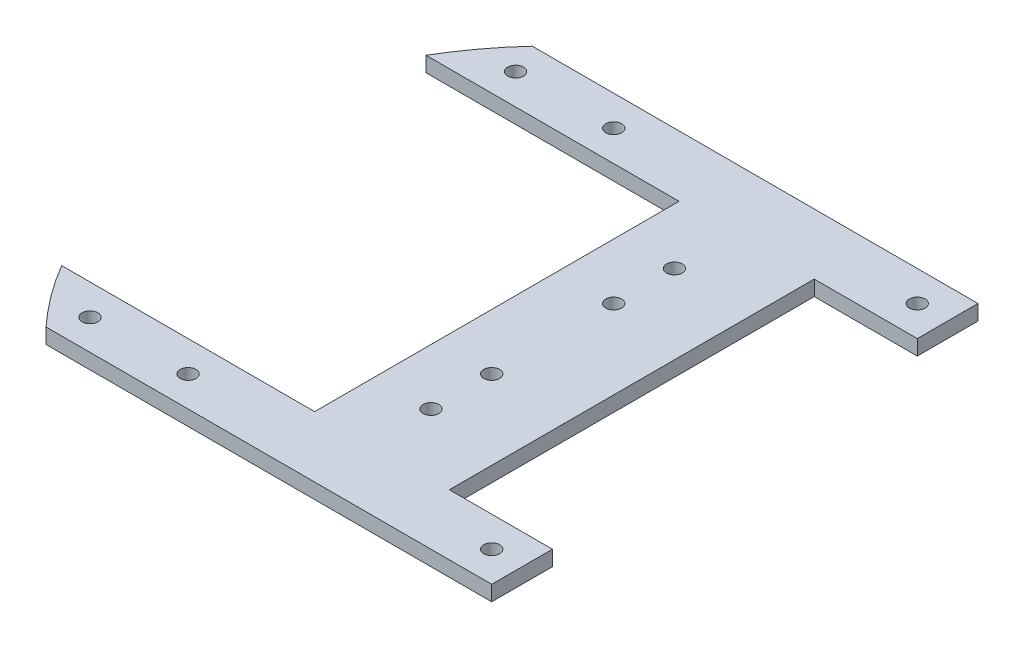
ISO-10303-21;
HEADER;
FILE_DESCRIPTION(('STEP AP214'),'2;1');
FILE_NAME('part.step','',(''),(''),'','','');
FILE_SCHEMA(('AUTOMOTIVE_DESIGN { 1 0 10303 214 1 1 1 1 }'));
ENDSEC;
DATA;
#1=APPLICATION_CONTEXT('core data for automotive mechanical design processes');
#2=APPLICATION_PROTOCOL_DEFINITION('international standard','automotive_design',2000,#1);
#3=PRODUCT_CONTEXT('',#1,'mechanical');
#4=PRODUCT('Part','Part','',(#3));
#5=PRODUCT_RELATED_PRODUCT_CATEGORY('part','',(#4));
#6=PRODUCT_DEFINITION_FORMATION('','',#4);
#7=PRODUCT_DEFINITION_CONTEXT('part definition',#1,'design');
#8=PRODUCT_DEFINITION('design','',#6,#7);
#9=PRODUCT_DEFINITION_SHAPE('','',#8);
#10=(LENGTH_UNIT() NAMED_UNIT(*) SI_UNIT(.MILLI.,.METRE.));
#11=(NAMED_UNIT(*) PLANE_ANGLE_UNIT() SI_UNIT($,.RADIAN.));
#12=(NAMED_UNIT(*) SI_UNIT($,.STERADIAN.) SOLID_ANGLE_UNIT());
#13=UNCERTAINTY_MEASURE_WITH_UNIT(LENGTH_MEASURE(1.E-05),#10,'distance_accuracy_value','');
#14=(GEOMETRIC_REPRESENTATION_CONTEXT(3) GLOBAL_UNCERTAINTY_ASSIGNED_CONTEXT((#13)) GLOBAL_UNIT_ASSIGNED_CONTEXT((#10,
#11,#12)) REPRESENTATION_CONTEXT('',''));
#15=CARTESIAN_POINT('',(0.,0.,0.));
#16=DIRECTION('',(0.,0.,1.));
#17=DIRECTION('',(1.,0.,0.));
#18=AXIS2_PLACEMENT_3D('',#15,#16,#17);
#19=CARTESIAN_POINT('',(0.,3.175,0.));
#20=DIRECTION('',(0.,1.,0.));
#21=DIRECTION('',(0.,0.,1.));
#22=AXIS2_PLACEMENT_3D('',#19,#20,#21);
#23=PLANE('',#22);
#24=DIRECTION('',(-1.,0.,0.));
#25=VECTOR('',#24,1.);
#26=CARTESIAN_POINT('',(-64.6017801612308,3.175,-38.1));
#27=LINE('',#26,#25);
#28=CARTESIAN_POINT('',(-11.6869128143214,3.175,-38.1));
#29=VERTEX_POINT('',#28);
#30=CARTESIAN_POINT('',(-64.6017801612308,3.175,-38.1));
#31=VERTEX_POINT('',#30);
#32=EDGE_CURVE('E130',#29,#31,#27,.T.);
#33=ORIENTED_EDGE('',*,*,#32,.F.);
#34=DIRECTION('',(0.,0.,-1.));
#35=VECTOR('',#34,1.);
#36=CARTESIAN_POINT('',(-11.6869128143214,3.175,-38.1));
#37=LINE('',#36,#35);
#38=CARTESIAN_POINT('',(-11.6869128143214,3.175,38.1));
#39=VERTEX_POINT('',#38);
#40=EDGE_CURVE('E139',#39,#29,#37,.T.);
#41=ORIENTED_EDGE('',*,*,#40,.F.);
#42=DIRECTION('',(1.,0.,0.));
#43=VECTOR('',#42,1.);
#44=CARTESIAN_POINT('',(-11.6869128143214,3.175,38.1));
#45=LINE('',#44,#43);
#46=CARTESIAN_POINT('',(-64.6017801612308,3.175,38.1));
#47=VERTEX_POINT('',#46);
#48=EDGE_CURVE('E124',#47,#39,#45,.T.);
#49=ORIENTED_EDGE('',*,*,#48,.F.);
#50=CARTESIAN_POINT('',(0.,3.175,0.));
#51=DIRECTION('',(0.,1.,0.));
#52=DIRECTION('',(0.,0.,1.));
#53=AXIS2_PLACEMENT_3D('',#50,#51,#52);
#54=CIRCLE('',#53,75.);
#55=CARTESIAN_POINT('',(-55.1227591712517,3.175,50.8574618059944));
#56=VERTEX_POINT('',#55);
#57=EDGE_CURVE('E136',#47,#56,#54,.T.);
#58=ORIENTED_EDGE('',*,*,#57,.T.);
#59=DIRECTION('',(1.,0.,0.));
#60=VECTOR('',#59,1.);
#61=CARTESIAN_POINT('',(55.1227591712517,3.175,50.8574618059944));
#62=LINE('',#61,#60);
#63=CARTESIAN_POINT('',(38.1,3.175,50.8574618059944));
#64=VERTEX_POINT('',#63);
#65=EDGE_CURVE('E144',#56,#64,#62,.T.);
#66=ORIENTED_EDGE('',*,*,#65,.T.);
#67=DIRECTION('',(0.,0.,1.));
#68=VECTOR('',#67,1.);
#69=CARTESIAN_POINT('',(38.1,3.175,50.8574618059944));
#70=LINE('',#69,#68);
#71=CARTESIAN_POINT('',(38.1,3.175,38.1574618059944));
#72=VERTEX_POINT('',#71);
#73=EDGE_CURVE('E56',#72,#64,#70,.T.);
#74=ORIENTED_EDGE('',*,*,#73,.F.);
#75=DIRECTION('',(1.,0.,0.));
#76=VECTOR('',#75,1.);
#77=CARTESIAN_POINT('',(38.1,3.175,38.1574618059944));
#78=LINE('',#77,#76);
#79=CARTESIAN_POINT('',(16.55045545372,3.175,38.1574618059944));
#80=VERTEX_POINT('',#79);
#81=EDGE_CURVE('E195',#80,#72,#78,.T.);
#82=ORIENTED_EDGE('',*,*,#81,.F.);
#83=DIRECTION('',(0.,0.,1.));
#84=VECTOR('',#83,1.);
#85=CARTESIAN_POINT('',(16.55045545372,3.175,38.1574618059944));
#86=LINE('',#85,#84);
#87=CARTESIAN_POINT('',(16.55045545372,3.175,-38.1574618059944));
#88=VERTEX_POINT('',#87);
#89=EDGE_CURVE('E192',#88,#80,#86,.T.);
#90=ORIENTED_EDGE('',*,*,#89,.F.);
#91=DIRECTION('',(-1.,0.,0.));
#92=VECTOR('',#91,1.);
#93=CARTESIAN_POINT('',(16.55045545372,3.175,-38.1574618059944));
#94=LINE('',#93,#92);
#95=CARTESIAN_POINT('',(38.1,3.175,-38.1574618059944));
#96=VERTEX_POINT('',#95);
#97=EDGE_CURVE('E188',#96,#88,#94,.T.);
#98=ORIENTED_EDGE('',*,*,#97,.F.);
#99=DIRECTION('',(0.,0.,1.));
#100=VECTOR('',#99,1.);
#101=CARTESIAN_POINT('',(38.1,3.175,-38.1574618059944));
#102=LINE('',#101,#100);
#103=CARTESIAN_POINT('',(38.1,3.175,-50.8574618059944));
#104=VERTEX_POINT('',#103);
#105=EDGE_CURVE('E185',#104,#96,#102,.T.);
#106=ORIENTED_EDGE('',*,*,#105,.F.);
#107=DIRECTION('',(-1.,0.,0.));
#108=VECTOR('',#107,1.);
#109=CARTESIAN_POINT('',(-55.1227591712517,3.175,-50.8574618059944));
#110=LINE('',#109,#108);
#111=CARTESIAN_POINT('',(-55.1227591712517,3.175,-50.8574618059945));
#112=VERTEX_POINT('',#111);
#113=EDGE_CURVE('E149',#104,#112,#110,.T.);
#114=ORIENTED_EDGE('',*,*,#113,.T.);
#115=CARTESIAN_POINT('',(0.,3.175,0.));
#116=DIRECTION('',(0.,1.,0.));
#117=DIRECTION('',(0.,0.,1.));
#118=AXIS2_PLACEMENT_3D('',#115,#116,#117);
#119=CIRCLE('',#118,75.);
#120=EDGE_CURVE('E145',#112,#31,#119,.T.);
#121=ORIENTED_EDGE('',*,*,#120,.T.);
#122=EDGE_LOOP('',(#33,#41,#49,#58,#66,#74,#82,#90,#98,#106,#114,#121));
#123=FACE_BOUND('',#122,.T.);
#124=CARTESIAN_POINT('',(0.,3.175,-25.4574618059944));
#125=DIRECTION('',(0.,1.,0.));
#126=DIRECTION('',(0.,0.,-1.));
#127=AXIS2_PLACEMENT_3D('',#124,#125,#126);
#128=CIRCLE('',#127,1.65099999999997);
#129=CARTESIAN_POINT('',(0.,3.175,-27.1084618059944));
#130=VERTEX_POINT('',#129);
#131=EDGE_CURVE('E215',#130,#130,#128,.T.);
#132=ORIENTED_EDGE('',*,*,#131,.F.);
#133=EDGE_LOOP('',(#132));
#134=FACE_BOUND('',#133,.T.);
#135=CARTESIAN_POINT('',(-31.75,3.175,-44.5074618059944));
#136=DIRECTION('',(0.,1.,0.));
#137=DIRECTION('',(0.,0.,1.));
#138=AXIS2_PLACEMENT_3D('',#135,#136,#137);
#139=CIRCLE('',#138,1.65099999999997);
#140=CARTESIAN_POINT('',(-31.75,3.175,-42.8564618059944));
#141=VERTEX_POINT('',#140);
#142=EDGE_CURVE('E227',#141,#141,#139,.T.);
#143=ORIENTED_EDGE('',*,*,#142,.F.);
#144=EDGE_LOOP('',(#143));
#145=FACE_BOUND('',#144,.T.);
#146=CARTESIAN_POINT('',(-52.2676605903492,3.175,-44.5074618059944));
#147=DIRECTION('',(0.,1.,0.));
#148=DIRECTION('',(0.,0.,1.));
#149=AXIS2_PLACEMENT_3D('',#146,#147,#148);
#150=CIRCLE('',#149,1.65099999999997);
#151=CARTESIAN_POINT('',(-52.2676605903492,3.175,-42.8564618059944));
#152=VERTEX_POINT('',#151);
#153=EDGE_CURVE('E239',#152,#152,#150,.T.);
#154=ORIENTED_EDGE('',*,*,#153,.F.);
#155=EDGE_LOOP('',(#154));
#156=FACE_BOUND('',#155,.T.);
#157=CARTESIAN_POINT('',(31.75,3.175,44.5074618059944));
#158=DIRECTION('',(0.,1.,0.));
#159=DIRECTION('',(0.,0.,1.));
#160=AXIS2_PLACEMENT_3D('',#157,#158,#159);
#161=CIRCLE('',#160,1.65099999999998);
#162=CARTESIAN_POINT('',(31.75,3.175,46.1584618059944));
#163=VERTEX_POINT('',#162);
#164=EDGE_CURVE('E251',#163,#163,#161,.T.);
#165=ORIENTED_EDGE('',*,*,#164,.F.);
#166=EDGE_LOOP('',(#165));
#167=FACE_BOUND('',#166,.T.);
#168=CARTESIAN_POINT('',(0.,3.175,12.7574618059944));
#169=DIRECTION('',(0.,1.,0.));
#170=DIRECTION('',(0.,0.,1.));
#171=AXIS2_PLACEMENT_3D('',#168,#169,#170);
#172=CIRCLE('',#171,1.65099999999997);
#173=CARTESIAN_POINT('',(0.,3.175,14.4084618059944));
#174=VERTEX_POINT('',#173);
#175=EDGE_CURVE('E156',#174,#174,#172,.T.);
#176=ORIENTED_EDGE('',*,*,#175,.F.);
#177=EDGE_LOOP('',(#176));
#178=FACE_BOUND('',#177,.T.);
#179=CARTESIAN_POINT('',(0.,3.175,25.4574618059944));
#180=DIRECTION('',(0.,1.,0.));
#181=DIRECTION('',(0.,0.,1.));
#182=AXIS2_PLACEMENT_3D('',#179,#180,#181);
#183=CIRCLE('',#182,1.65099999999997);
#184=CARTESIAN_POINT('',(0.,3.175,27.1084618059944));
#185=VERTEX_POINT('',#184);
#186=EDGE_CURVE('E257',#185,#185,#183,.T.);
#187=ORIENTED_EDGE('',*,*,#186,.F.);
#188=EDGE_LOOP('',(#187));
#189=FACE_BOUND('',#188,.T.);
#190=CARTESIAN_POINT('',(-31.75,3.175,44.5074618059944));
#191=DIRECTION('',(0.,1.,0.));
#192=DIRECTION('',(0.,0.,1.));
#193=AXIS2_PLACEMENT_3D('',#190,#191,#192);
#194=CIRCLE('',#193,1.65099999999997);
#195=CARTESIAN_POINT('',(-31.75,3.175,46.1584618059944));
#196=VERTEX_POINT('',#195);
#197=EDGE_CURVE('E245',#196,#196,#194,.T.);
#198=ORIENTED_EDGE('',*,*,#197,.F.);
#199=EDGE_LOOP('',(#198));
#200=FACE_BOUND('',#199,.T.);
#201=CARTESIAN_POINT('',(-52.2676605903492,3.175,44.5074618059944));
#202=DIRECTION('',(0.,1.,0.));
#203=DIRECTION('',(0.,0.,1.));
#204=AXIS2_PLACEMENT_3D('',#201,#202,#203);
#205=CIRCLE('',#204,1.65099999999997);
#206=CARTESIAN_POINT('',(-52.2676605903492,3.175,46.1584618059944));
#207=VERTEX_POINT('',#206);
#208=EDGE_CURVE('E233',#207,#207,#205,.T.);
#209=ORIENTED_EDGE('',*,*,#208,.F.);
#210=EDGE_LOOP('',(#209));
#211=FACE_BOUND('',#210,.T.);
#212=CARTESIAN_POINT('',(31.75,3.175,-44.5074618059944));
#213=DIRECTION('',(0.,1.,0.));
#214=DIRECTION('',(0.,0.,1.));
#215=AXIS2_PLACEMENT_3D('',#212,#213,#214);
#216=CIRCLE('',#215,1.65099999999997);
#217=CARTESIAN_POINT('',(31.75,3.175,-42.8564618059944));
#218=VERTEX_POINT('',#217);
#219=EDGE_CURVE('E221',#218,#218,#216,.T.);
#220=ORIENTED_EDGE('',*,*,#219,.F.);
#221=EDGE_LOOP('',(#220));
#222=FACE_BOUND('',#221,.T.);
#223=CARTESIAN_POINT('',(0.,3.175,-12.7574618059944));
#224=DIRECTION('',(0.,1.,0.));
#225=DIRECTION('',(0.,0.,-1.));
#226=AXIS2_PLACEMENT_3D('',#223,#224,#225);
#227=CIRCLE('',#226,1.65099999999997);
#228=CARTESIAN_POINT('',(0.,3.175,-14.4084618059944));
#229=VERTEX_POINT('',#228);
#230=EDGE_CURVE('E179',#229,#229,#227,.T.);
#231=ORIENTED_EDGE('',*,*,#230,.F.);
#232=EDGE_LOOP('',(#231));
#233=FACE_BOUND('',#232,.T.);
#234=ADVANCED_FACE('F33',(#123,#134,#145,#156,#167,#178,#189,#200,#211,#222,#233),#23,.T.);
#235=CARTESIAN_POINT('',(0.,0.,0.));
#236=DIRECTION('',(0.,1.,0.));
#237=DIRECTION('',(0.,0.,1.));
#238=AXIS2_PLACEMENT_3D('',#235,#236,#237);
#239=PLANE('',#238);
#240=CARTESIAN_POINT('',(0.,0.,-25.4574618059944));
#241=DIRECTION('',(0.,1.,0.));
#242=DIRECTION('',(0.,0.,-1.));
#243=AXIS2_PLACEMENT_3D('',#240,#241,#242);
#244=CIRCLE('',#243,1.65099999999997);
#245=CARTESIAN_POINT('',(0.,0.,-27.1084618059944));
#246=VERTEX_POINT('',#245);
#247=EDGE_CURVE('E213',#246,#246,#244,.T.);
#248=ORIENTED_EDGE('',*,*,#247,.T.);
#249=EDGE_LOOP('',(#248));
#250=FACE_BOUND('',#249,.T.);
#251=CARTESIAN_POINT('',(-31.75,0.,-44.5074618059944));
#252=DIRECTION('',(0.,1.,0.));
#253=DIRECTION('',(0.,0.,1.));
#254=AXIS2_PLACEMENT_3D('',#251,#252,#253);
#255=CIRCLE('',#254,1.65099999999997);
#256=CARTESIAN_POINT('',(-31.75,0.,-42.8564618059944));
#257=VERTEX_POINT('',#256);
#258=EDGE_CURVE('E224',#257,#257,#255,.T.);
#259=ORIENTED_EDGE('',*,*,#258,.T.);
#260=EDGE_LOOP('',(#259));
#261=FACE_BOUND('',#260,.T.);
#262=CARTESIAN_POINT('',(-52.2676605903492,0.,-44.5074618059944));
#263=DIRECTION('',(0.,1.,0.));
#264=DIRECTION('',(0.,0.,1.));
#265=AXIS2_PLACEMENT_3D('',#262,#263,#264);
#266=CIRCLE('',#265,1.65099999999997);
#267=CARTESIAN_POINT('',(-52.2676605903492,0.,-42.8564618059944));
#268=VERTEX_POINT('',#267);
#269=EDGE_CURVE('E236',#268,#268,#266,.T.);
#270=ORIENTED_EDGE('',*,*,#269,.T.);
#271=EDGE_LOOP('',(#270));
#272=FACE_BOUND('',#271,.T.);
#273=CARTESIAN_POINT('',(31.75,0.,44.5074618059944));
#274=DIRECTION('',(0.,1.,0.));
#275=DIRECTION('',(0.,0.,1.));
#276=AXIS2_PLACEMENT_3D('',#273,#274,#275);
#277=CIRCLE('',#276,1.65099999999998);
#278=CARTESIAN_POINT('',(31.75,0.,46.1584618059944));
#279=VERTEX_POINT('',#278);
#280=EDGE_CURVE('E248',#279,#279,#277,.T.);
#281=ORIENTED_EDGE('',*,*,#280,.T.);
#282=EDGE_LOOP('',(#281));
#283=FACE_BOUND('',#282,.T.);
#284=CARTESIAN_POINT('',(0.,0.,12.7574618059944));
#285=DIRECTION('',(0.,1.,0.));
#286=DIRECTION('',(0.,0.,1.));
#287=AXIS2_PLACEMENT_3D('',#284,#285,#286);
#288=CIRCLE('',#287,1.65099999999997);
#289=CARTESIAN_POINT('',(0.,0.,14.4084618059944));
#290=VERTEX_POINT('',#289);
#291=EDGE_CURVE('E260',#290,#290,#288,.T.);
#292=ORIENTED_EDGE('',*,*,#291,.T.);
#293=EDGE_LOOP('',(#292));
#294=FACE_BOUND('',#293,.T.);
#295=DIRECTION('',(0.,0.,1.));
#296=VECTOR('',#295,1.);
#297=CARTESIAN_POINT('',(-11.6869128143214,0.,-38.1));
#298=LINE('',#297,#296);
#299=CARTESIAN_POINT('',(-11.6869128143214,0.,-38.1));
#300=VERTEX_POINT('',#299);
#301=CARTESIAN_POINT('',(-11.6869128143214,0.,38.1));
#302=VERTEX_POINT('',#301);
#303=EDGE_CURVE('E283',#300,#302,#298,.T.);
#304=ORIENTED_EDGE('',*,*,#303,.F.);
#305=DIRECTION('',(1.,0.,0.));
#306=VECTOR('',#305,1.);
#307=CARTESIAN_POINT('',(-64.6017801612308,0.,-38.1));
#308=LINE('',#307,#306);
#309=CARTESIAN_POINT('',(-64.6017801612308,0.,-38.1));
#310=VERTEX_POINT('',#309);
#311=EDGE_CURVE('E189',#310,#300,#308,.T.);
#312=ORIENTED_EDGE('',*,*,#311,.F.);
#313=CARTESIAN_POINT('',(0.,0.,0.));
#314=DIRECTION('',(0.,1.,0.));
#315=DIRECTION('',(0.,0.,1.));
#316=AXIS2_PLACEMENT_3D('',#313,#314,#315);
#317=CIRCLE('',#316,75.);
#318=CARTESIAN_POINT('',(-55.1227591712517,0.,-50.8574618059945));
#319=VERTEX_POINT('',#318);
#320=EDGE_CURVE('E155',#319,#310,#317,.T.);
#321=ORIENTED_EDGE('',*,*,#320,.F.);
#322=DIRECTION('',(-1.,0.,0.));
#323=VECTOR('',#322,1.);
#324=CARTESIAN_POINT('',(-55.1227591712517,0.,-50.8574618059944));
#325=LINE('',#324,#323);
#326=CARTESIAN_POINT('',(38.1,0.,-50.8574618059944));
#327=VERTEX_POINT('',#326);
#328=EDGE_CURVE('E153',#327,#319,#325,.T.);
#329=ORIENTED_EDGE('',*,*,#328,.F.);
#330=DIRECTION('',(0.,0.,-1.));
#331=VECTOR('',#330,1.);
#332=CARTESIAN_POINT('',(38.1,0.,-38.1574618059944));
#333=LINE('',#332,#331);
#334=CARTESIAN_POINT('',(38.1,0.,-38.1574618059944));
#335=VERTEX_POINT('',#334);
#336=EDGE_CURVE('E202',#335,#327,#333,.T.);
#337=ORIENTED_EDGE('',*,*,#336,.F.);
#338=DIRECTION('',(1.,0.,0.));
#339=VECTOR('',#338,1.);
#340=CARTESIAN_POINT('',(16.55045545372,0.,-38.1574618059944));
#341=LINE('',#340,#339);
#342=CARTESIAN_POINT('',(16.55045545372,0.,-38.1574618059944));
#343=VERTEX_POINT('',#342);
#344=EDGE_CURVE('E291',#343,#335,#341,.T.);
#345=ORIENTED_EDGE('',*,*,#344,.F.);
#346=DIRECTION('',(0.,0.,-1.));
#347=VECTOR('',#346,1.);
#348=CARTESIAN_POINT('',(16.55045545372,0.,38.1574618059944));
#349=LINE('',#348,#347);
#350=CARTESIAN_POINT('',(16.55045545372,0.,38.1574618059944));
#351=VERTEX_POINT('',#350);
#352=EDGE_CURVE('E181',#351,#343,#349,.T.);
#353=ORIENTED_EDGE('',*,*,#352,.F.);
#354=DIRECTION('',(-1.,0.,0.));
#355=VECTOR('',#354,1.);
#356=CARTESIAN_POINT('',(38.1,0.,38.1574618059944));
#357=LINE('',#356,#355);
#358=CARTESIAN_POINT('',(38.1,0.,38.1574618059944));
#359=VERTEX_POINT('',#358);
#360=EDGE_CURVE('E174',#359,#351,#357,.T.);
#361=ORIENTED_EDGE('',*,*,#360,.F.);
#362=DIRECTION('',(0.,0.,-1.));
#363=VECTOR('',#362,1.);
#364=CARTESIAN_POINT('',(38.1,0.,50.8574618059944));
#365=LINE('',#364,#363);
#366=CARTESIAN_POINT('',(38.1,0.,50.8574618059944));
#367=VERTEX_POINT('',#366);
#368=EDGE_CURVE('E172',#367,#359,#365,.T.);
#369=ORIENTED_EDGE('',*,*,#368,.F.);
#370=DIRECTION('',(1.,0.,0.));
#371=VECTOR('',#370,1.);
#372=CARTESIAN_POINT('',(55.1227591712517,0.,50.8574618059944));
#373=LINE('',#372,#371);
#374=CARTESIAN_POINT('',(-55.1227591712517,0.,50.8574618059944));
#375=VERTEX_POINT('',#374);
#376=EDGE_CURVE('E161',#375,#367,#373,.T.);
#377=ORIENTED_EDGE('',*,*,#376,.F.);
#378=CARTESIAN_POINT('',(0.,0.,0.));
#379=DIRECTION('',(0.,1.,0.));
#380=DIRECTION('',(0.,0.,1.));
#381=AXIS2_PLACEMENT_3D('',#378,#379,#380);
#382=CIRCLE('',#381,75.);
#383=CARTESIAN_POINT('',(-64.6017801612308,0.,38.1));
#384=VERTEX_POINT('',#383);
#385=EDGE_CURVE('E159',#384,#375,#382,.T.);
#386=ORIENTED_EDGE('',*,*,#385,.F.);
#387=DIRECTION('',(-1.,0.,0.));
#388=VECTOR('',#387,1.);
#389=CARTESIAN_POINT('',(-11.6869128143214,0.,38.1));
#390=LINE('',#389,#388);
#391=EDGE_CURVE('E48',#302,#384,#390,.T.);
#392=ORIENTED_EDGE('',*,*,#391,.F.);
#393=EDGE_LOOP('',(#304,#312,#321,#329,#337,#345,#353,#361,#369,#377,#386,#392));
#394=FACE_BOUND('',#393,.T.);
#395=CARTESIAN_POINT('',(0.,0.,25.4574618059944));
#396=DIRECTION('',(0.,1.,0.));
#397=DIRECTION('',(0.,0.,1.));
#398=AXIS2_PLACEMENT_3D('',#395,#396,#397);
#399=CIRCLE('',#398,1.65099999999997);
#400=CARTESIAN_POINT('',(0.,0.,27.1084618059944));
#401=VERTEX_POINT('',#400);
#402=EDGE_CURVE('E254',#401,#401,#399,.T.);
#403=ORIENTED_EDGE('',*,*,#402,.T.);
#404=EDGE_LOOP('',(#403));
#405=FACE_BOUND('',#404,.T.);
#406=CARTESIAN_POINT('',(-31.75,0.,44.5074618059944));
#407=DIRECTION('',(0.,1.,0.));
#408=DIRECTION('',(0.,0.,1.));
#409=AXIS2_PLACEMENT_3D('',#406,#407,#408);
#410=CIRCLE('',#409,1.65099999999997);
#411=CARTESIAN_POINT('',(-31.75,0.,46.1584618059944));
#412=VERTEX_POINT('',#411);
#413=EDGE_CURVE('E242',#412,#412,#410,.T.);
#414=ORIENTED_EDGE('',*,*,#413,.T.);
#415=EDGE_LOOP('',(#414));
#416=FACE_BOUND('',#415,.T.);
#417=CARTESIAN_POINT('',(-52.2676605903492,0.,44.5074618059944));
#418=DIRECTION('',(0.,1.,0.));
#419=DIRECTION('',(0.,0.,1.));
#420=AXIS2_PLACEMENT_3D('',#417,#418,#419);
#421=CIRCLE('',#420,1.65099999999997);
#422=CARTESIAN_POINT('',(-52.2676605903492,0.,46.1584618059944));
#423=VERTEX_POINT('',#422);
#424=EDGE_CURVE('E230',#423,#423,#421,.T.);
#425=ORIENTED_EDGE('',*,*,#424,.T.);
#426=EDGE_LOOP('',(#425));
#427=FACE_BOUND('',#426,.T.);
#428=CARTESIAN_POINT('',(31.75,0.,-44.5074618059944));
#429=DIRECTION('',(0.,1.,0.));
#430=DIRECTION('',(0.,0.,1.));
#431=AXIS2_PLACEMENT_3D('',#428,#429,#430);
#432=CIRCLE('',#431,1.65099999999997);
#433=CARTESIAN_POINT('',(31.75,0.,-42.8564618059944));
#434=VERTEX_POINT('',#433);
#435=EDGE_CURVE('E218',#434,#434,#432,.T.);
#436=ORIENTED_EDGE('',*,*,#435,.T.);
#437=EDGE_LOOP('',(#436));
#438=FACE_BOUND('',#437,.T.);
#439=CARTESIAN_POINT('',(0.,0.,-12.7574618059944));
#440=DIRECTION('',(0.,1.,0.));
#441=DIRECTION('',(0.,0.,-1.));
#442=AXIS2_PLACEMENT_3D('',#439,#440,#441);
#443=CIRCLE('',#442,1.65099999999997);
#444=CARTESIAN_POINT('',(0.,0.,-14.4084618059944));
#445=VERTEX_POINT('',#444);
#446=EDGE_CURVE('E176',#445,#445,#443,.T.);
#447=ORIENTED_EDGE('',*,*,#446,.T.);
#448=EDGE_LOOP('',(#447));
#449=FACE_BOUND('',#448,.T.);
#450=ADVANCED_FACE('F169',(#250,#261,#272,#283,#294,#394,#405,#416,#427,#438,#449),#239,.F.);
#451=CARTESIAN_POINT('',(-55.1227591712517,3.175,-50.8574618059944));
#452=DIRECTION('',(0.,0.,1.));
#453=DIRECTION('',(1.,0.,0.));
#454=AXIS2_PLACEMENT_3D('',#451,#452,#453);
#455=PLANE('',#454);
#456=ORIENTED_EDGE('',*,*,#113,.F.);
#457=DIRECTION('',(0.,1.,0.));
#458=VECTOR('',#457,1.);
#459=CARTESIAN_POINT('',(38.1,-113.659544464589,-50.8574618059944));
#460=LINE('',#459,#458);
#461=EDGE_CURVE('E199',#327,#104,#460,.T.);
#462=ORIENTED_EDGE('',*,*,#461,.F.);
#463=ORIENTED_EDGE('',*,*,#328,.T.);
#464=DIRECTION('',(0.,-1.,0.));
#465=VECTOR('',#464,1.);
#466=CARTESIAN_POINT('',(-55.1227591712517,3.175,-50.8574618059945));
#467=LINE('',#466,#465);
#468=EDGE_CURVE('E11',#112,#319,#467,.T.);
#469=ORIENTED_EDGE('',*,*,#468,.F.);
#470=EDGE_LOOP('',(#456,#462,#463,#469));
#471=FACE_BOUND('',#470,.T.);
#472=ADVANCED_FACE('F35',(#471),#455,.F.);
#473=CARTESIAN_POINT('',(0.,3.175,0.));
#474=DIRECTION('',(0.,-1.,0.));
#475=DIRECTION('',(0.,0.,-1.));
#476=AXIS2_PLACEMENT_3D('',#473,#474,#475);
#477=CYLINDRICAL_SURFACE('',#476,75.);
#478=ORIENTED_EDGE('',*,*,#320,.T.);
#479=DIRECTION('',(0.,1.,0.));
#480=VECTOR('',#479,1.);
#481=CARTESIAN_POINT('',(-64.6017801612308,-113.659544464589,-38.1));
#482=LINE('',#481,#480);
#483=EDGE_CURVE('E278',#310,#31,#482,.T.);
#484=ORIENTED_EDGE('',*,*,#483,.T.);
#485=ORIENTED_EDGE('',*,*,#120,.F.);
#486=ORIENTED_EDGE('',*,*,#468,.T.);
#487=EDGE_LOOP('',(#478,#484,#485,#486));
#488=FACE_BOUND('',#487,.T.);
#489=ADVANCED_FACE('F277',(#488),#477,.T.);
#490=CARTESIAN_POINT('',(0.,3.175,0.));
#491=DIRECTION('',(0.,-1.,0.));
#492=DIRECTION('',(0.,0.,-1.));
#493=AXIS2_PLACEMENT_3D('',#490,#491,#492);
#494=CYLINDRICAL_SURFACE('',#493,75.);
#495=ORIENTED_EDGE('',*,*,#57,.F.);
#496=DIRECTION('',(0.,1.,0.));
#497=VECTOR('',#496,1.);
#498=CARTESIAN_POINT('',(-64.6017801612308,-113.659544464589,38.1));
#499=LINE('',#498,#497);
#500=EDGE_CURVE('E121',#384,#47,#499,.T.);
#501=ORIENTED_EDGE('',*,*,#500,.F.);
#502=ORIENTED_EDGE('',*,*,#385,.T.);
#503=DIRECTION('',(0.,-1.,0.));
#504=VECTOR('',#503,1.);
#505=CARTESIAN_POINT('',(-55.1227591712517,3.175,50.8574618059944));
#506=LINE('',#505,#504);
#507=EDGE_CURVE('E41',#56,#375,#506,.T.);
#508=ORIENTED_EDGE('',*,*,#507,.F.);
#509=EDGE_LOOP('',(#495,#501,#502,#508));
#510=FACE_BOUND('',#509,.T.);
#511=ADVANCED_FACE('F141',(#510),#494,.T.);
#512=CARTESIAN_POINT('',(55.1227591712517,3.175,50.8574618059944));
#513=DIRECTION('',(0.,0.,-1.));
#514=DIRECTION('',(-1.,0.,0.));
#515=AXIS2_PLACEMENT_3D('',#512,#513,#514);
#516=PLANE('',#515);
#517=ORIENTED_EDGE('',*,*,#376,.T.);
#518=DIRECTION('',(0.,1.,0.));
#519=VECTOR('',#518,1.);
#520=CARTESIAN_POINT('',(38.1,-113.659544464589,50.8574618059944));
#521=LINE('',#520,#519);
#522=EDGE_CURVE('E200',#367,#64,#521,.T.);
#523=ORIENTED_EDGE('',*,*,#522,.T.);
#524=ORIENTED_EDGE('',*,*,#65,.F.);
#525=ORIENTED_EDGE('',*,*,#507,.T.);
#526=EDGE_LOOP('',(#517,#523,#524,#525));
#527=FACE_BOUND('',#526,.T.);
#528=ADVANCED_FACE('F165',(#527),#516,.F.);
#529=CARTESIAN_POINT('',(0.,3.175,12.7574618059944));
#530=DIRECTION('',(0.,-1.,0.));
#531=DIRECTION('',(0.,0.,-1.));
#532=AXIS2_PLACEMENT_3D('',#529,#530,#531);
#533=CYLINDRICAL_SURFACE('',#532,1.65099999999997);
#534=ORIENTED_EDGE('',*,*,#175,.T.);
#535=EDGE_LOOP('',(#534));
#536=FACE_BOUND('',#535,.T.);
#537=ORIENTED_EDGE('',*,*,#291,.F.);
#538=EDGE_LOOP('',(#537));
#539=FACE_BOUND('',#538,.T.);
#540=ADVANCED_FACE('F328',(#536,#539),#533,.F.);
#541=CARTESIAN_POINT('',(0.,3.175,25.4574618059944));
#542=DIRECTION('',(0.,-1.,0.));
#543=DIRECTION('',(0.,0.,-1.));
#544=AXIS2_PLACEMENT_3D('',#541,#542,#543);
#545=CYLINDRICAL_SURFACE('',#544,1.65099999999997);
#546=ORIENTED_EDGE('',*,*,#186,.T.);
#547=EDGE_LOOP('',(#546));
#548=FACE_BOUND('',#547,.T.);
#549=ORIENTED_EDGE('',*,*,#402,.F.);
#550=EDGE_LOOP('',(#549));
#551=FACE_BOUND('',#550,.T.);
#552=ADVANCED_FACE('F424',(#548,#551),#545,.F.);
#553=CARTESIAN_POINT('',(31.75,3.175,44.5074618059944));
#554=DIRECTION('',(0.,-1.,0.));
#555=DIRECTION('',(0.,0.,-1.));
#556=AXIS2_PLACEMENT_3D('',#553,#554,#555);
#557=CYLINDRICAL_SURFACE('',#556,1.65099999999998);
#558=ORIENTED_EDGE('',*,*,#164,.T.);
#559=EDGE_LOOP('',(#558));
#560=FACE_BOUND('',#559,.T.);
#561=ORIENTED_EDGE('',*,*,#280,.F.);
#562=EDGE_LOOP('',(#561));
#563=FACE_BOUND('',#562,.T.);
#564=ADVANCED_FACE('F414',(#560,#563),#557,.F.);
#565=CARTESIAN_POINT('',(-31.75,3.175,44.5074618059944));
#566=DIRECTION('',(0.,-1.,0.));
#567=DIRECTION('',(0.,0.,-1.));
#568=AXIS2_PLACEMENT_3D('',#565,#566,#567);
#569=CYLINDRICAL_SURFACE('',#568,1.65099999999997);
#570=ORIENTED_EDGE('',*,*,#197,.T.);
#571=EDGE_LOOP('',(#570));
#572=FACE_BOUND('',#571,.T.);
#573=ORIENTED_EDGE('',*,*,#413,.F.);
#574=EDGE_LOOP('',(#573));
#575=FACE_BOUND('',#574,.T.);
#576=ADVANCED_FACE('F404',(#572,#575),#569,.F.);
#577=CARTESIAN_POINT('',(-52.2676605903492,3.175,-44.5074618059944));
#578=DIRECTION('',(0.,-1.,0.));
#579=DIRECTION('',(0.,0.,-1.));
#580=AXIS2_PLACEMENT_3D('',#577,#578,#579);
#581=CYLINDRICAL_SURFACE('',#580,1.65099999999997);
#582=ORIENTED_EDGE('',*,*,#153,.T.);
#583=EDGE_LOOP('',(#582));
#584=FACE_BOUND('',#583,.T.);
#585=ORIENTED_EDGE('',*,*,#269,.F.);
#586=EDGE_LOOP('',(#585));
#587=FACE_BOUND('',#586,.T.);
#588=ADVANCED_FACE('F394',(#584,#587),#581,.F.);
#589=CARTESIAN_POINT('',(-52.2676605903492,3.175,44.5074618059944));
#590=DIRECTION('',(0.,-1.,0.));
#591=DIRECTION('',(0.,0.,-1.));
#592=AXIS2_PLACEMENT_3D('',#589,#590,#591);
#593=CYLINDRICAL_SURFACE('',#592,1.65099999999997);
#594=ORIENTED_EDGE('',*,*,#208,.T.);
#595=EDGE_LOOP('',(#594));
#596=FACE_BOUND('',#595,.T.);
#597=ORIENTED_EDGE('',*,*,#424,.F.);
#598=EDGE_LOOP('',(#597));
#599=FACE_BOUND('',#598,.T.);
#600=ADVANCED_FACE('F384',(#596,#599),#593,.F.);
#601=CARTESIAN_POINT('',(-31.75,3.175,-44.5074618059944));
#602=DIRECTION('',(0.,-1.,0.));
#603=DIRECTION('',(0.,0.,-1.));
#604=AXIS2_PLACEMENT_3D('',#601,#602,#603);
#605=CYLINDRICAL_SURFACE('',#604,1.65099999999997);
#606=ORIENTED_EDGE('',*,*,#142,.T.);
#607=EDGE_LOOP('',(#606));
#608=FACE_BOUND('',#607,.T.);
#609=ORIENTED_EDGE('',*,*,#258,.F.);
#610=EDGE_LOOP('',(#609));
#611=FACE_BOUND('',#610,.T.);
#612=ADVANCED_FACE('F374',(#608,#611),#605,.F.);
#613=CARTESIAN_POINT('',(31.75,3.175,-44.5074618059944));
#614=DIRECTION('',(0.,-1.,0.));
#615=DIRECTION('',(0.,0.,-1.));
#616=AXIS2_PLACEMENT_3D('',#613,#614,#615);
#617=CYLINDRICAL_SURFACE('',#616,1.65099999999997);
#618=ORIENTED_EDGE('',*,*,#219,.T.);
#619=EDGE_LOOP('',(#618));
#620=FACE_BOUND('',#619,.T.);
#621=ORIENTED_EDGE('',*,*,#435,.F.);
#622=EDGE_LOOP('',(#621));
#623=FACE_BOUND('',#622,.T.);
#624=ADVANCED_FACE('F364',(#620,#623),#617,.F.);
#625=CARTESIAN_POINT('',(0.,3.175,-25.4574618059944));
#626=DIRECTION('',(0.,-1.,0.));
#627=DIRECTION('',(0.,0.,-1.));
#628=AXIS2_PLACEMENT_3D('',#625,#626,#627);
#629=CYLINDRICAL_SURFACE('',#628,1.65099999999997);
#630=ORIENTED_EDGE('',*,*,#131,.T.);
#631=EDGE_LOOP('',(#630));
#632=FACE_BOUND('',#631,.T.);
#633=ORIENTED_EDGE('',*,*,#247,.F.);
#634=EDGE_LOOP('',(#633));
#635=FACE_BOUND('',#634,.T.);
#636=ADVANCED_FACE('F316',(#632,#635),#629,.F.);
#637=CARTESIAN_POINT('',(0.,3.175,-12.7574618059944));
#638=DIRECTION('',(0.,-1.,0.));
#639=DIRECTION('',(0.,0.,-1.));
#640=AXIS2_PLACEMENT_3D('',#637,#638,#639);
#641=CYLINDRICAL_SURFACE('',#640,1.65099999999997);
#642=ORIENTED_EDGE('',*,*,#230,.T.);
#643=EDGE_LOOP('',(#642));
#644=FACE_BOUND('',#643,.T.);
#645=ORIENTED_EDGE('',*,*,#446,.F.);
#646=EDGE_LOOP('',(#645));
#647=FACE_BOUND('',#646,.T.);
#648=ADVANCED_FACE('F309',(#644,#647),#641,.F.);
#649=CARTESIAN_POINT('',(38.1,-113.659544464589,50.8574618059944));
#650=DIRECTION('',(-1.,0.,0.));
#651=DIRECTION('',(0.,0.,1.));
#652=AXIS2_PLACEMENT_3D('',#649,#650,#651);
#653=PLANE('',#652);
#654=ORIENTED_EDGE('',*,*,#368,.T.);
#655=DIRECTION('',(0.,1.,0.));
#656=VECTOR('',#655,1.);
#657=CARTESIAN_POINT('',(38.1,-113.659544464589,38.1574618059944));
#658=LINE('',#657,#656);
#659=EDGE_CURVE('E203',#359,#72,#658,.T.);
#660=ORIENTED_EDGE('',*,*,#659,.T.);
#661=ORIENTED_EDGE('',*,*,#73,.T.);
#662=ORIENTED_EDGE('',*,*,#522,.F.);
#663=EDGE_LOOP('',(#654,#660,#661,#662));
#664=FACE_BOUND('',#663,.T.);
#665=ADVANCED_FACE('F307',(#664),#653,.F.);
#666=CARTESIAN_POINT('',(38.1,-113.659544464589,38.1574618059944));
#667=DIRECTION('',(0.,0.,1.));
#668=DIRECTION('',(1.,0.,0.));
#669=AXIS2_PLACEMENT_3D('',#666,#667,#668);
#670=PLANE('',#669);
#671=ORIENTED_EDGE('',*,*,#360,.T.);
#672=DIRECTION('',(0.,1.,0.));
#673=VECTOR('',#672,1.);
#674=CARTESIAN_POINT('',(16.55045545372,-113.659544464589,38.1574618059944));
#675=LINE('',#674,#673);
#676=EDGE_CURVE('E205',#351,#80,#675,.T.);
#677=ORIENTED_EDGE('',*,*,#676,.T.);
#678=ORIENTED_EDGE('',*,*,#81,.T.);
#679=ORIENTED_EDGE('',*,*,#659,.F.);
#680=EDGE_LOOP('',(#671,#677,#678,#679));
#681=FACE_BOUND('',#680,.T.);
#682=ADVANCED_FACE('F306',(#681),#670,.F.);
#683=CARTESIAN_POINT('',(16.55045545372,-113.659544464589,38.1574618059944));
#684=DIRECTION('',(-1.,0.,0.));
#685=DIRECTION('',(0.,0.,1.));
#686=AXIS2_PLACEMENT_3D('',#683,#684,#685);
#687=PLANE('',#686);
#688=ORIENTED_EDGE('',*,*,#352,.T.);
#689=DIRECTION('',(0.,1.,0.));
#690=VECTOR('',#689,1.);
#691=CARTESIAN_POINT('',(16.55045545372,-113.659544464589,-38.1574618059944));
#692=LINE('',#691,#690);
#693=EDGE_CURVE('E207',#343,#88,#692,.T.);
#694=ORIENTED_EDGE('',*,*,#693,.T.);
#695=ORIENTED_EDGE('',*,*,#89,.T.);
#696=ORIENTED_EDGE('',*,*,#676,.F.);
#697=EDGE_LOOP('',(#688,#694,#695,#696));
#698=FACE_BOUND('',#697,.T.);
#699=ADVANCED_FACE('F295',(#698),#687,.F.);
#700=CARTESIAN_POINT('',(16.55045545372,-113.659544464589,-38.1574618059944));
#701=DIRECTION('',(0.,0.,-1.));
#702=DIRECTION('',(-1.,0.,0.));
#703=AXIS2_PLACEMENT_3D('',#700,#701,#702);
#704=PLANE('',#703);
#705=ORIENTED_EDGE('',*,*,#344,.T.);
#706=DIRECTION('',(0.,1.,0.));
#707=VECTOR('',#706,1.);
#708=CARTESIAN_POINT('',(38.1,-113.659544464589,-38.1574618059944));
#709=LINE('',#708,#707);
#710=EDGE_CURVE('E209',#335,#96,#709,.T.);
#711=ORIENTED_EDGE('',*,*,#710,.T.);
#712=ORIENTED_EDGE('',*,*,#97,.T.);
#713=ORIENTED_EDGE('',*,*,#693,.F.);
#714=EDGE_LOOP('',(#705,#711,#712,#713));
#715=FACE_BOUND('',#714,.T.);
#716=ADVANCED_FACE('F298',(#715),#704,.F.);
#717=CARTESIAN_POINT('',(38.1,-113.659544464589,-38.1574618059944));
#718=DIRECTION('',(-1.,0.,0.));
#719=DIRECTION('',(0.,0.,1.));
#720=AXIS2_PLACEMENT_3D('',#717,#718,#719);
#721=PLANE('',#720);
#722=ORIENTED_EDGE('',*,*,#336,.T.);
#723=ORIENTED_EDGE('',*,*,#461,.T.);
#724=ORIENTED_EDGE('',*,*,#105,.T.);
#725=ORIENTED_EDGE('',*,*,#710,.F.);
#726=EDGE_LOOP('',(#722,#723,#724,#725));
#727=FACE_BOUND('',#726,.T.);
#728=ADVANCED_FACE('F303',(#727),#721,.F.);
#729=CARTESIAN_POINT('',(-64.6017801612308,-113.659544464589,-38.1));
#730=DIRECTION('',(0.,0.,-1.));
#731=DIRECTION('',(-1.,0.,0.));
#732=AXIS2_PLACEMENT_3D('',#729,#730,#731);
#733=PLANE('',#732);
#734=ORIENTED_EDGE('',*,*,#311,.T.);
#735=DIRECTION('',(0.,1.,0.));
#736=VECTOR('',#735,1.);
#737=CARTESIAN_POINT('',(-11.6869128143214,-113.659544464589,-38.1));
#738=LINE('',#737,#736);
#739=EDGE_CURVE('E281',#300,#29,#738,.T.);
#740=ORIENTED_EDGE('',*,*,#739,.T.);
#741=ORIENTED_EDGE('',*,*,#32,.T.);
#742=ORIENTED_EDGE('',*,*,#483,.F.);
#743=EDGE_LOOP('',(#734,#740,#741,#742));
#744=FACE_BOUND('',#743,.T.);
#745=ADVANCED_FACE('F493',(#744),#733,.F.);
#746=CARTESIAN_POINT('',(-11.6869128143214,-113.659544464589,-38.1));
#747=DIRECTION('',(1.,0.,0.));
#748=DIRECTION('',(0.,0.,-1.));
#749=AXIS2_PLACEMENT_3D('',#746,#747,#748);
#750=PLANE('',#749);
#751=ORIENTED_EDGE('',*,*,#303,.T.);
#752=DIRECTION('',(0.,1.,0.));
#753=VECTOR('',#752,1.);
#754=CARTESIAN_POINT('',(-11.6869128143214,-113.659544464589,38.1));
#755=LINE('',#754,#753);
#756=EDGE_CURVE('E129',#302,#39,#755,.T.);
#757=ORIENTED_EDGE('',*,*,#756,.T.);
#758=ORIENTED_EDGE('',*,*,#40,.T.);
#759=ORIENTED_EDGE('',*,*,#739,.F.);
#760=EDGE_LOOP('',(#751,#757,#758,#759));
#761=FACE_BOUND('',#760,.T.);
#762=ADVANCED_FACE('F502',(#761),#750,.F.);
#763=CARTESIAN_POINT('',(-11.6869128143214,-113.659544464589,38.1));
#764=DIRECTION('',(0.,0.,1.));
#765=DIRECTION('',(1.,0.,0.));
#766=AXIS2_PLACEMENT_3D('',#763,#764,#765);
#767=PLANE('',#766);
#768=ORIENTED_EDGE('',*,*,#391,.T.);
#769=ORIENTED_EDGE('',*,*,#500,.T.);
#770=ORIENTED_EDGE('',*,*,#48,.T.);
#771=ORIENTED_EDGE('',*,*,#756,.F.);
#772=EDGE_LOOP('',(#768,#769,#770,#771));
#773=FACE_BOUND('',#772,.T.);
#774=ADVANCED_FACE('F123',(#773),#767,.F.);
#775=CLOSED_SHELL('',(#234,#450,#472,#489,#511,#528,#540,#552,#564,#576,#588,#600,#612,#624,
#636,#648,#665,#682,#699,#716,#728,#745,#762,#774));
#776=MANIFOLD_SOLID_BREP('B2',#775);
#777=ADVANCED_BREP_SHAPE_REPRESENTATION('',(#18,#776),#14);
#778=SHAPE_DEFINITION_REPRESENTATION(#9,#777);
ENDSEC;
END-ISO-10303-21;
